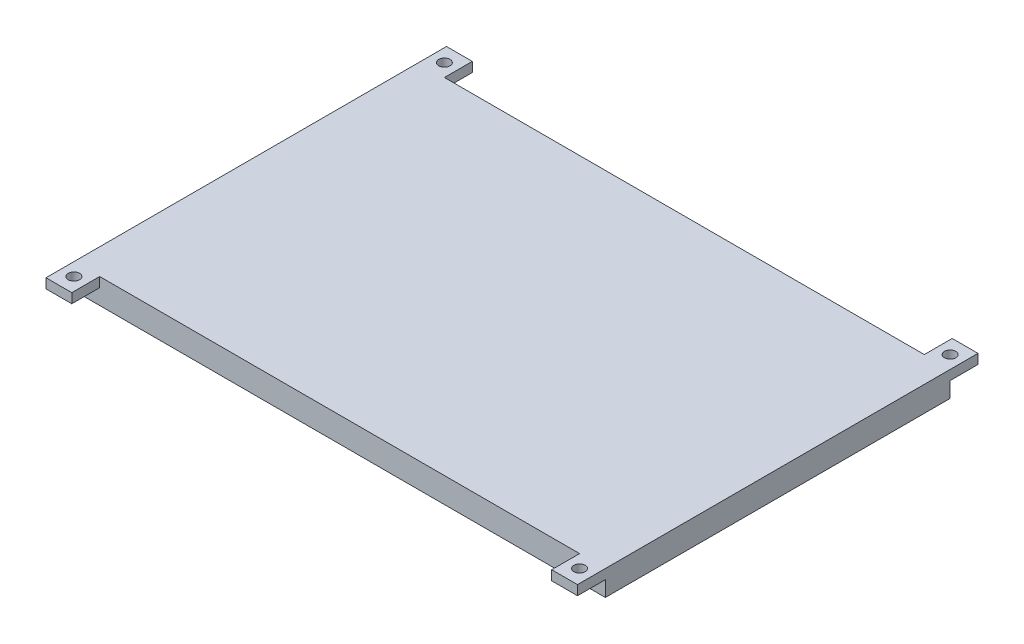
ISO-10303-21;
HEADER;
FILE_DESCRIPTION(('STEP AP214'),'2;1');
FILE_NAME('part.step','',(''),(''),'','','');
FILE_SCHEMA(('AUTOMOTIVE_DESIGN { 1 0 10303 214 1 1 1 1 }'));
ENDSEC;
DATA;
#1=APPLICATION_CONTEXT('core data for automotive mechanical design processes');
#2=APPLICATION_PROTOCOL_DEFINITION('international standard','automotive_design',2000,#1);
#3=PRODUCT_CONTEXT('',#1,'mechanical');
#4=PRODUCT('Part','Part','',(#3));
#5=PRODUCT_RELATED_PRODUCT_CATEGORY('part','',(#4));
#6=PRODUCT_DEFINITION_FORMATION('','',#4);
#7=PRODUCT_DEFINITION_CONTEXT('part definition',#1,'design');
#8=PRODUCT_DEFINITION('design','',#6,#7);
#9=PRODUCT_DEFINITION_SHAPE('','',#8);
#10=(LENGTH_UNIT() NAMED_UNIT(*) SI_UNIT(.MILLI.,.METRE.));
#11=(NAMED_UNIT(*) PLANE_ANGLE_UNIT() SI_UNIT($,.RADIAN.));
#12=(NAMED_UNIT(*) SI_UNIT($,.STERADIAN.) SOLID_ANGLE_UNIT());
#13=UNCERTAINTY_MEASURE_WITH_UNIT(LENGTH_MEASURE(1.E-05),#10,'distance_accuracy_value','');
#14=(GEOMETRIC_REPRESENTATION_CONTEXT(3) GLOBAL_UNCERTAINTY_ASSIGNED_CONTEXT((#13)) GLOBAL_UNIT_ASSIGNED_CONTEXT((#10,
#11,#12)) REPRESENTATION_CONTEXT('',''));
#15=CARTESIAN_POINT('',(0.,0.,0.));
#16=DIRECTION('',(0.,0.,1.));
#17=DIRECTION('',(1.,0.,0.));
#18=AXIS2_PLACEMENT_3D('',#15,#16,#17);
#19=CARTESIAN_POINT('',(0.,0.,0.));
#20=DIRECTION('',(0.,1.,0.));
#21=DIRECTION('',(1.,0.,0.));
#22=AXIS2_PLACEMENT_3D('',#19,#20,#21);
#23=PLANE('',#22);
#24=CARTESIAN_POINT('',(78.45,0.,57.48));
#25=DIRECTION('',(0.,-1.,0.));
#26=DIRECTION('',(1.,0.,0.));
#27=AXIS2_PLACEMENT_3D('',#24,#25,#26);
#28=CIRCLE('',#27,1.75);
#29=CARTESIAN_POINT('',(76.7,0.,57.48));
#30=VERTEX_POINT('',#29);
#31=EDGE_CURVE('E451',#30,#30,#28,.T.);
#32=ORIENTED_EDGE('',*,*,#31,.F.);
#33=EDGE_LOOP('',(#32));
#34=FACE_BOUND('',#33,.T.);
#35=DIRECTION('',(1.,0.,0.));
#36=VECTOR('',#35,1.);
#37=CARTESIAN_POINT('',(41.225,0.,53.48));
#38=LINE('',#37,#36);
#39=CARTESIAN_POINT('',(74.45,0.,53.48));
#40=VERTEX_POINT('',#39);
#41=CARTESIAN_POINT('',(82.45,0.,53.48));
#42=VERTEX_POINT('',#41);
#43=EDGE_CURVE('E229',#40,#42,#38,.T.);
#44=ORIENTED_EDGE('',*,*,#43,.T.);
#45=DIRECTION('',(0.,0.,1.));
#46=VECTOR('',#45,1.);
#47=CARTESIAN_POINT('',(82.45,0.,-62.135));
#48=LINE('',#47,#46);
#49=CARTESIAN_POINT('',(82.45,0.,62.135));
#50=VERTEX_POINT('',#49);
#51=EDGE_CURVE('E233',#42,#50,#48,.T.);
#52=ORIENTED_EDGE('',*,*,#51,.T.);
#53=DIRECTION('',(-1.,0.,0.));
#54=VECTOR('',#53,1.);
#55=CARTESIAN_POINT('',(82.45,0.,62.135));
#56=LINE('',#55,#54);
#57=CARTESIAN_POINT('',(74.45,0.,62.135));
#58=VERTEX_POINT('',#57);
#59=EDGE_CURVE('E273',#50,#58,#56,.T.);
#60=ORIENTED_EDGE('',*,*,#59,.T.);
#61=DIRECTION('',(0.,0.,1.));
#62=VECTOR('',#61,1.);
#63=CARTESIAN_POINT('',(74.45,0.,-62.135));
#64=LINE('',#63,#62);
#65=EDGE_CURVE('E235',#40,#58,#64,.T.);
#66=ORIENTED_EDGE('',*,*,#65,.F.);
#67=EDGE_LOOP('',(#44,#52,#60,#66));
#68=FACE_BOUND('',#67,.T.);
#69=ADVANCED_FACE('F17',(#34,#68),#23,.F.);
#70=CARTESIAN_POINT('',(0.,3.,0.));
#71=DIRECTION('',(0.,1.,0.));
#72=DIRECTION('',(1.,0.,0.));
#73=AXIS2_PLACEMENT_3D('',#70,#71,#72);
#74=PLANE('',#73);
#75=CARTESIAN_POINT('',(78.45,3.,-57.48));
#76=DIRECTION('',(0.,-1.,0.));
#77=DIRECTION('',(1.,0.,0.));
#78=AXIS2_PLACEMENT_3D('',#75,#76,#77);
#79=CIRCLE('',#78,1.75);
#80=CARTESIAN_POINT('',(76.7,3.,-57.48));
#81=VERTEX_POINT('',#80);
#82=EDGE_CURVE('E427',#81,#81,#79,.T.);
#83=ORIENTED_EDGE('',*,*,#82,.T.);
#84=EDGE_LOOP('',(#83));
#85=FACE_BOUND('',#84,.T.);
#86=CARTESIAN_POINT('',(-78.45,3.,-57.48));
#87=DIRECTION('',(0.,-1.,0.));
#88=DIRECTION('',(1.,0.,0.));
#89=AXIS2_PLACEMENT_3D('',#86,#87,#88);
#90=CIRCLE('',#89,1.75);
#91=CARTESIAN_POINT('',(-80.2,3.,-57.48));
#92=VERTEX_POINT('',#91);
#93=EDGE_CURVE('E436',#92,#92,#90,.T.);
#94=ORIENTED_EDGE('',*,*,#93,.T.);
#95=EDGE_LOOP('',(#94));
#96=FACE_BOUND('',#95,.T.);
#97=CARTESIAN_POINT('',(78.45,3.,57.48));
#98=DIRECTION('',(0.,-1.,0.));
#99=DIRECTION('',(1.,0.,0.));
#100=AXIS2_PLACEMENT_3D('',#97,#98,#99);
#101=CIRCLE('',#100,1.75);
#102=CARTESIAN_POINT('',(76.7,3.,57.48));
#103=VERTEX_POINT('',#102);
#104=EDGE_CURVE('E443',#103,#103,#101,.T.);
#105=ORIENTED_EDGE('',*,*,#104,.T.);
#106=EDGE_LOOP('',(#105));
#107=FACE_BOUND('',#106,.T.);
#108=CARTESIAN_POINT('',(-78.45,3.,57.48));
#109=DIRECTION('',(0.,-1.,0.));
#110=DIRECTION('',(1.,0.,0.));
#111=AXIS2_PLACEMENT_3D('',#108,#109,#110);
#112=CIRCLE('',#111,1.75);
#113=CARTESIAN_POINT('',(-80.2,3.,57.48));
#114=VERTEX_POINT('',#113);
#115=EDGE_CURVE('E453',#114,#114,#112,.T.);
#116=ORIENTED_EDGE('',*,*,#115,.T.);
#117=EDGE_LOOP('',(#116));
#118=FACE_BOUND('',#117,.T.);
#119=DIRECTION('',(-1.,0.,0.));
#120=VECTOR('',#119,1.);
#121=CARTESIAN_POINT('',(-82.45,3.,-62.135));
#122=LINE('',#121,#120);
#123=CARTESIAN_POINT('',(82.45,3.,-62.135));
#124=VERTEX_POINT('',#123);
#125=CARTESIAN_POINT('',(74.45,3.,-62.135));
#126=VERTEX_POINT('',#125);
#127=EDGE_CURVE('E11',#124,#126,#122,.T.);
#128=ORIENTED_EDGE('',*,*,#127,.T.);
#129=DIRECTION('',(0.,0.,1.));
#130=VECTOR('',#129,1.);
#131=CARTESIAN_POINT('',(74.45,3.,-62.135));
#132=LINE('',#131,#130);
#133=CARTESIAN_POINT('',(74.45,3.,-53.48));
#134=VERTEX_POINT('',#133);
#135=EDGE_CURVE('E42',#126,#134,#132,.T.);
#136=ORIENTED_EDGE('',*,*,#135,.T.);
#137=DIRECTION('',(-1.,0.,0.));
#138=VECTOR('',#137,1.);
#139=CARTESIAN_POINT('',(74.45,3.,-53.48));
#140=LINE('',#139,#138);
#141=CARTESIAN_POINT('',(-74.45,3.,-53.48));
#142=VERTEX_POINT('',#141);
#143=EDGE_CURVE('E316',#134,#142,#140,.T.);
#144=ORIENTED_EDGE('',*,*,#143,.T.);
#145=DIRECTION('',(0.,0.,-1.));
#146=VECTOR('',#145,1.);
#147=CARTESIAN_POINT('',(-74.45,3.,62.135));
#148=LINE('',#147,#146);
#149=CARTESIAN_POINT('',(-74.45,3.,-62.135));
#150=VERTEX_POINT('',#149);
#151=EDGE_CURVE('E308',#142,#150,#148,.T.);
#152=ORIENTED_EDGE('',*,*,#151,.T.);
#153=DIRECTION('',(-1.,0.,0.));
#154=VECTOR('',#153,1.);
#155=CARTESIAN_POINT('',(-82.45,3.,-62.135));
#156=LINE('',#155,#154);
#157=CARTESIAN_POINT('',(-82.45,3.,-62.135));
#158=VERTEX_POINT('',#157);
#159=EDGE_CURVE('E307',#150,#158,#156,.T.);
#160=ORIENTED_EDGE('',*,*,#159,.T.);
#161=DIRECTION('',(0.,0.,1.));
#162=VECTOR('',#161,1.);
#163=CARTESIAN_POINT('',(-82.45,3.,62.135));
#164=LINE('',#163,#162);
#165=CARTESIAN_POINT('',(-82.45,3.,62.135));
#166=VERTEX_POINT('',#165);
#167=EDGE_CURVE('E291',#158,#166,#164,.T.);
#168=ORIENTED_EDGE('',*,*,#167,.T.);
#169=DIRECTION('',(1.,0.,0.));
#170=VECTOR('',#169,1.);
#171=CARTESIAN_POINT('',(82.45,3.,62.135));
#172=LINE('',#171,#170);
#173=CARTESIAN_POINT('',(-74.45,3.,62.135));
#174=VERTEX_POINT('',#173);
#175=EDGE_CURVE('E292',#166,#174,#172,.T.);
#176=ORIENTED_EDGE('',*,*,#175,.T.);
#177=DIRECTION('',(0.,0.,-1.));
#178=VECTOR('',#177,1.);
#179=CARTESIAN_POINT('',(-74.45,3.,62.135));
#180=LINE('',#179,#178);
#181=CARTESIAN_POINT('',(-74.45,3.,53.48));
#182=VERTEX_POINT('',#181);
#183=EDGE_CURVE('E240',#174,#182,#180,.T.);
#184=ORIENTED_EDGE('',*,*,#183,.T.);
#185=DIRECTION('',(1.,0.,0.));
#186=VECTOR('',#185,1.);
#187=CARTESIAN_POINT('',(-74.45,3.,53.48));
#188=LINE('',#187,#186);
#189=CARTESIAN_POINT('',(74.45,3.,53.48));
#190=VERTEX_POINT('',#189);
#191=EDGE_CURVE('E281',#182,#190,#188,.T.);
#192=ORIENTED_EDGE('',*,*,#191,.T.);
#193=DIRECTION('',(0.,0.,1.));
#194=VECTOR('',#193,1.);
#195=CARTESIAN_POINT('',(74.45,3.,-62.135));
#196=LINE('',#195,#194);
#197=CARTESIAN_POINT('',(74.45,3.,62.135));
#198=VERTEX_POINT('',#197);
#199=EDGE_CURVE('E276',#190,#198,#196,.T.);
#200=ORIENTED_EDGE('',*,*,#199,.T.);
#201=DIRECTION('',(1.,0.,0.));
#202=VECTOR('',#201,1.);
#203=CARTESIAN_POINT('',(82.45,3.,62.135));
#204=LINE('',#203,#202);
#205=CARTESIAN_POINT('',(82.45,3.,62.135));
#206=VERTEX_POINT('',#205);
#207=EDGE_CURVE('E485',#198,#206,#204,.T.);
#208=ORIENTED_EDGE('',*,*,#207,.T.);
#209=DIRECTION('',(0.,0.,-1.));
#210=VECTOR('',#209,1.);
#211=CARTESIAN_POINT('',(82.45,3.,-62.135));
#212=LINE('',#211,#210);
#213=EDGE_CURVE('E265',#206,#124,#212,.T.);
#214=ORIENTED_EDGE('',*,*,#213,.T.);
#215=EDGE_LOOP('',(#128,#136,#144,#152,#160,#168,#176,#184,#192,#200,#208,#214));
#216=FACE_BOUND('',#215,.T.);
#217=ADVANCED_FACE('F336',(#85,#96,#107,#118,#216),#74,.T.);
#218=CARTESIAN_POINT('',(82.45,0.,-62.135));
#219=DIRECTION('',(0.,0.,-1.));
#220=DIRECTION('',(-1.,0.,0.));
#221=AXIS2_PLACEMENT_3D('',#218,#219,#220);
#222=PLANE('',#221);
#223=DIRECTION('',(1.,0.,0.));
#224=VECTOR('',#223,1.);
#225=CARTESIAN_POINT('',(-82.45,0.,-62.135));
#226=LINE('',#225,#224);
#227=CARTESIAN_POINT('',(74.45,0.,-62.135));
#228=VERTEX_POINT('',#227);
#229=CARTESIAN_POINT('',(82.45,0.,-62.135));
#230=VERTEX_POINT('',#229);
#231=EDGE_CURVE('E379',#228,#230,#226,.T.);
#232=ORIENTED_EDGE('',*,*,#231,.F.);
#233=DIRECTION('',(0.,1.,0.));
#234=VECTOR('',#233,1.);
#235=CARTESIAN_POINT('',(74.45,0.,-62.135));
#236=LINE('',#235,#234);
#237=EDGE_CURVE('E25',#228,#126,#236,.T.);
#238=ORIENTED_EDGE('',*,*,#237,.T.);
#239=ORIENTED_EDGE('',*,*,#127,.F.);
#240=DIRECTION('',(0.,1.,0.));
#241=VECTOR('',#240,1.);
#242=CARTESIAN_POINT('',(82.45,0.,-62.135));
#243=LINE('',#242,#241);
#244=EDGE_CURVE('E268',#230,#124,#243,.T.);
#245=ORIENTED_EDGE('',*,*,#244,.F.);
#246=EDGE_LOOP('',(#232,#238,#239,#245));
#247=FACE_BOUND('',#246,.T.);
#248=ADVANCED_FACE('F555',(#247),#222,.T.);
#249=CARTESIAN_POINT('',(74.45,0.,-62.135));
#250=DIRECTION('',(-1.,0.,0.));
#251=DIRECTION('',(0.,0.,1.));
#252=AXIS2_PLACEMENT_3D('',#249,#250,#251);
#253=PLANE('',#252);
#254=DIRECTION('',(0.,0.,1.));
#255=VECTOR('',#254,1.);
#256=CARTESIAN_POINT('',(74.45,0.,-62.135));
#257=LINE('',#256,#255);
#258=CARTESIAN_POINT('',(74.45,0.,-53.48));
#259=VERTEX_POINT('',#258);
#260=EDGE_CURVE('E329',#228,#259,#257,.T.);
#261=ORIENTED_EDGE('',*,*,#260,.T.);
#262=DIRECTION('',(0.,1.,0.));
#263=VECTOR('',#262,1.);
#264=CARTESIAN_POINT('',(74.45,0.,-53.48));
#265=LINE('',#264,#263);
#266=EDGE_CURVE('E319',#259,#134,#265,.T.);
#267=ORIENTED_EDGE('',*,*,#266,.T.);
#268=ORIENTED_EDGE('',*,*,#135,.F.);
#269=ORIENTED_EDGE('',*,*,#237,.F.);
#270=EDGE_LOOP('',(#261,#267,#268,#269));
#271=FACE_BOUND('',#270,.T.);
#272=ADVANCED_FACE('F327',(#271),#253,.T.);
#273=CARTESIAN_POINT('',(74.45,0.,-53.48));
#274=DIRECTION('',(0.,0.,-1.));
#275=DIRECTION('',(0.,-1.,0.));
#276=AXIS2_PLACEMENT_3D('',#273,#274,#275);
#277=PLANE('',#276);
#278=DIRECTION('',(0.,1.,0.));
#279=VECTOR('',#278,1.);
#280=CARTESIAN_POINT('',(-74.45,0.,-53.48));
#281=LINE('',#280,#279);
#282=CARTESIAN_POINT('',(-74.45,0.,-53.48));
#283=VERTEX_POINT('',#282);
#284=EDGE_CURVE('E311',#283,#142,#281,.T.);
#285=ORIENTED_EDGE('',*,*,#284,.T.);
#286=ORIENTED_EDGE('',*,*,#143,.F.);
#287=ORIENTED_EDGE('',*,*,#266,.F.);
#288=DIRECTION('',(-1.,0.,0.));
#289=VECTOR('',#288,1.);
#290=CARTESIAN_POINT('',(-41.225,0.,-53.48));
#291=LINE('',#290,#289);
#292=CARTESIAN_POINT('',(82.45,0.,-53.48));
#293=VERTEX_POINT('',#292);
#294=EDGE_CURVE('E377',#293,#259,#291,.T.);
#295=ORIENTED_EDGE('',*,*,#294,.F.);
#296=DIRECTION('',(0.,-1.,0.));
#297=VECTOR('',#296,1.);
#298=CARTESIAN_POINT('',(82.45,0.,-53.48));
#299=LINE('',#298,#297);
#300=CARTESIAN_POINT('',(82.45,-4.8,-53.48));
#301=VERTEX_POINT('',#300);
#302=EDGE_CURVE('E252',#293,#301,#299,.T.);
#303=ORIENTED_EDGE('',*,*,#302,.T.);
#304=DIRECTION('',(1.,0.,0.));
#305=VECTOR('',#304,1.);
#306=CARTESIAN_POINT('',(82.45,-4.8,-53.48));
#307=LINE('',#306,#305);
#308=CARTESIAN_POINT('',(-82.45,-4.8,-53.48));
#309=VERTEX_POINT('',#308);
#310=EDGE_CURVE('E474',#309,#301,#307,.T.);
#311=ORIENTED_EDGE('',*,*,#310,.F.);
#312=DIRECTION('',(0.,-1.,0.));
#313=VECTOR('',#312,1.);
#314=CARTESIAN_POINT('',(-82.45,0.,-53.48));
#315=LINE('',#314,#313);
#316=CARTESIAN_POINT('',(-82.45,0.,-53.48));
#317=VERTEX_POINT('',#316);
#318=EDGE_CURVE('E304',#317,#309,#315,.T.);
#319=ORIENTED_EDGE('',*,*,#318,.F.);
#320=DIRECTION('',(-1.,0.,0.));
#321=VECTOR('',#320,1.);
#322=CARTESIAN_POINT('',(-41.225,0.,-53.48));
#323=LINE('',#322,#321);
#324=EDGE_CURVE('E359',#283,#317,#323,.T.);
#325=ORIENTED_EDGE('',*,*,#324,.F.);
#326=EDGE_LOOP('',(#285,#286,#287,#295,#303,#311,#319,#325));
#327=FACE_BOUND('',#326,.T.);
#328=ADVANCED_FACE('F333',(#327),#277,.T.);
#329=CARTESIAN_POINT('',(-74.45,0.,-53.48));
#330=DIRECTION('',(1.,0.,0.));
#331=DIRECTION('',(0.,1.,0.));
#332=AXIS2_PLACEMENT_3D('',#329,#330,#331);
#333=PLANE('',#332);
#334=DIRECTION('',(0.,0.,-1.));
#335=VECTOR('',#334,1.);
#336=CARTESIAN_POINT('',(-74.45,0.,62.135));
#337=LINE('',#336,#335);
#338=CARTESIAN_POINT('',(-74.45,0.,-62.135));
#339=VERTEX_POINT('',#338);
#340=EDGE_CURVE('E343',#283,#339,#337,.T.);
#341=ORIENTED_EDGE('',*,*,#340,.T.);
#342=DIRECTION('',(0.,1.,0.));
#343=VECTOR('',#342,1.);
#344=CARTESIAN_POINT('',(-74.45,0.,-62.135));
#345=LINE('',#344,#343);
#346=EDGE_CURVE('E312',#339,#150,#345,.T.);
#347=ORIENTED_EDGE('',*,*,#346,.T.);
#348=ORIENTED_EDGE('',*,*,#151,.F.);
#349=ORIENTED_EDGE('',*,*,#284,.F.);
#350=EDGE_LOOP('',(#341,#347,#348,#349));
#351=FACE_BOUND('',#350,.T.);
#352=ADVANCED_FACE('F341',(#351),#333,.T.);
#353=CARTESIAN_POINT('',(-74.45,0.,-62.135));
#354=DIRECTION('',(0.,0.,-1.));
#355=DIRECTION('',(-1.,0.,0.));
#356=AXIS2_PLACEMENT_3D('',#353,#354,#355);
#357=PLANE('',#356);
#358=DIRECTION('',(1.,0.,0.));
#359=VECTOR('',#358,1.);
#360=CARTESIAN_POINT('',(-82.45,0.,-62.135));
#361=LINE('',#360,#359);
#362=CARTESIAN_POINT('',(-82.45,0.,-62.135));
#363=VERTEX_POINT('',#362);
#364=EDGE_CURVE('E367',#363,#339,#361,.T.);
#365=ORIENTED_EDGE('',*,*,#364,.F.);
#366=DIRECTION('',(0.,1.,0.));
#367=VECTOR('',#366,1.);
#368=CARTESIAN_POINT('',(-82.45,0.,-62.135));
#369=LINE('',#368,#367);
#370=EDGE_CURVE('E300',#363,#158,#369,.T.);
#371=ORIENTED_EDGE('',*,*,#370,.T.);
#372=ORIENTED_EDGE('',*,*,#159,.F.);
#373=ORIENTED_EDGE('',*,*,#346,.F.);
#374=EDGE_LOOP('',(#365,#371,#372,#373));
#375=FACE_BOUND('',#374,.T.);
#376=ADVANCED_FACE('F349',(#375),#357,.T.);
#377=CARTESIAN_POINT('',(-82.45,0.,-62.135));
#378=DIRECTION('',(-1.,0.,0.));
#379=DIRECTION('',(0.,1.,0.));
#380=AXIS2_PLACEMENT_3D('',#377,#378,#379);
#381=PLANE('',#380);
#382=DIRECTION('',(0.,0.,-1.));
#383=VECTOR('',#382,1.);
#384=CARTESIAN_POINT('',(-82.45,0.,62.135));
#385=LINE('',#384,#383);
#386=CARTESIAN_POINT('',(-82.45,0.,62.135));
#387=VERTEX_POINT('',#386);
#388=CARTESIAN_POINT('',(-82.45,0.,53.48));
#389=VERTEX_POINT('',#388);
#390=EDGE_CURVE('E407',#387,#389,#385,.T.);
#391=ORIENTED_EDGE('',*,*,#390,.F.);
#392=DIRECTION('',(0.,1.,0.));
#393=VECTOR('',#392,1.);
#394=CARTESIAN_POINT('',(-82.45,0.,62.135));
#395=LINE('',#394,#393);
#396=EDGE_CURVE('E287',#387,#166,#395,.T.);
#397=ORIENTED_EDGE('',*,*,#396,.T.);
#398=ORIENTED_EDGE('',*,*,#167,.F.);
#399=ORIENTED_EDGE('',*,*,#370,.F.);
#400=DIRECTION('',(0.,0.,-1.));
#401=VECTOR('',#400,1.);
#402=CARTESIAN_POINT('',(-82.45,0.,62.135));
#403=LINE('',#402,#401);
#404=EDGE_CURVE('E363',#317,#363,#403,.T.);
#405=ORIENTED_EDGE('',*,*,#404,.F.);
#406=ORIENTED_EDGE('',*,*,#318,.T.);
#407=DIRECTION('',(0.,0.,-1.));
#408=VECTOR('',#407,1.);
#409=CARTESIAN_POINT('',(-82.45,-4.8,-53.48));
#410=LINE('',#409,#408);
#411=CARTESIAN_POINT('',(-82.45,-4.8,53.48));
#412=VERTEX_POINT('',#411);
#413=EDGE_CURVE('E477',#412,#309,#410,.T.);
#414=ORIENTED_EDGE('',*,*,#413,.F.);
#415=DIRECTION('',(0.,-1.,0.));
#416=VECTOR('',#415,1.);
#417=CARTESIAN_POINT('',(-82.45,0.,53.48));
#418=LINE('',#417,#416);
#419=EDGE_CURVE('E241',#389,#412,#418,.T.);
#420=ORIENTED_EDGE('',*,*,#419,.F.);
#421=EDGE_LOOP('',(#391,#397,#398,#399,#405,#406,#414,#420));
#422=FACE_BOUND('',#421,.T.);
#423=ADVANCED_FACE('F543',(#422),#381,.T.);
#424=CARTESIAN_POINT('',(-82.45,0.,62.135));
#425=DIRECTION('',(0.,0.,1.));
#426=DIRECTION('',(1.,0.,0.));
#427=AXIS2_PLACEMENT_3D('',#424,#425,#426);
#428=PLANE('',#427);
#429=DIRECTION('',(-1.,0.,0.));
#430=VECTOR('',#429,1.);
#431=CARTESIAN_POINT('',(82.45,0.,62.135));
#432=LINE('',#431,#430);
#433=CARTESIAN_POINT('',(-74.45,0.,62.135));
#434=VERTEX_POINT('',#433);
#435=EDGE_CURVE('E403',#434,#387,#432,.T.);
#436=ORIENTED_EDGE('',*,*,#435,.F.);
#437=DIRECTION('',(0.,1.,0.));
#438=VECTOR('',#437,1.);
#439=CARTESIAN_POINT('',(-74.45,0.,62.135));
#440=LINE('',#439,#438);
#441=EDGE_CURVE('E295',#434,#174,#440,.T.);
#442=ORIENTED_EDGE('',*,*,#441,.T.);
#443=ORIENTED_EDGE('',*,*,#175,.F.);
#444=ORIENTED_EDGE('',*,*,#396,.F.);
#445=EDGE_LOOP('',(#436,#442,#443,#444));
#446=FACE_BOUND('',#445,.T.);
#447=ADVANCED_FACE('F821',(#446),#428,.T.);
#448=CARTESIAN_POINT('',(-74.45,0.,62.135));
#449=DIRECTION('',(1.,0.,0.));
#450=DIRECTION('',(0.,1.,0.));
#451=AXIS2_PLACEMENT_3D('',#448,#449,#450);
#452=PLANE('',#451);
#453=DIRECTION('',(0.,0.,-1.));
#454=VECTOR('',#453,1.);
#455=CARTESIAN_POINT('',(-74.45,0.,62.135));
#456=LINE('',#455,#454);
#457=CARTESIAN_POINT('',(-74.45,0.,53.48));
#458=VERTEX_POINT('',#457);
#459=EDGE_CURVE('E399',#434,#458,#456,.T.);
#460=ORIENTED_EDGE('',*,*,#459,.T.);
#461=DIRECTION('',(0.,1.,0.));
#462=VECTOR('',#461,1.);
#463=CARTESIAN_POINT('',(-74.45,0.,53.48));
#464=LINE('',#463,#462);
#465=EDGE_CURVE('E284',#458,#182,#464,.T.);
#466=ORIENTED_EDGE('',*,*,#465,.T.);
#467=ORIENTED_EDGE('',*,*,#183,.F.);
#468=ORIENTED_EDGE('',*,*,#441,.F.);
#469=EDGE_LOOP('',(#460,#466,#467,#468));
#470=FACE_BOUND('',#469,.T.);
#471=ADVANCED_FACE('F534',(#470),#452,.T.);
#472=CARTESIAN_POINT('',(-74.45,0.,53.48));
#473=DIRECTION('',(0.,0.,1.));
#474=DIRECTION('',(1.,0.,0.));
#475=AXIS2_PLACEMENT_3D('',#472,#473,#474);
#476=PLANE('',#475);
#477=DIRECTION('',(0.,1.,0.));
#478=VECTOR('',#477,1.);
#479=CARTESIAN_POINT('',(74.45,0.,53.48));
#480=LINE('',#479,#478);
#481=EDGE_CURVE('E278',#40,#190,#480,.T.);
#482=ORIENTED_EDGE('',*,*,#481,.T.);
#483=ORIENTED_EDGE('',*,*,#191,.F.);
#484=ORIENTED_EDGE('',*,*,#465,.F.);
#485=DIRECTION('',(1.,0.,0.));
#486=VECTOR('',#485,1.);
#487=CARTESIAN_POINT('',(41.225,0.,53.48));
#488=LINE('',#487,#486);
#489=EDGE_CURVE('E395',#389,#458,#488,.T.);
#490=ORIENTED_EDGE('',*,*,#489,.F.);
#491=ORIENTED_EDGE('',*,*,#419,.T.);
#492=DIRECTION('',(-1.,0.,0.));
#493=VECTOR('',#492,1.);
#494=CARTESIAN_POINT('',(-82.45,-4.8,53.48));
#495=LINE('',#494,#493);
#496=CARTESIAN_POINT('',(82.45,-4.8,53.48));
#497=VERTEX_POINT('',#496);
#498=EDGE_CURVE('E247',#497,#412,#495,.T.);
#499=ORIENTED_EDGE('',*,*,#498,.F.);
#500=DIRECTION('',(0.,-1.,0.));
#501=VECTOR('',#500,1.);
#502=CARTESIAN_POINT('',(82.45,0.,53.48));
#503=LINE('',#502,#501);
#504=EDGE_CURVE('E244',#42,#497,#503,.T.);
#505=ORIENTED_EDGE('',*,*,#504,.F.);
#506=ORIENTED_EDGE('',*,*,#43,.F.);
#507=EDGE_LOOP('',(#482,#483,#484,#490,#491,#499,#505,#506));
#508=FACE_BOUND('',#507,.T.);
#509=ADVANCED_FACE('F245',(#508),#476,.T.);
#510=CARTESIAN_POINT('',(74.45,0.,53.48));
#511=DIRECTION('',(-1.,0.,0.));
#512=DIRECTION('',(0.,0.,1.));
#513=AXIS2_PLACEMENT_3D('',#510,#511,#512);
#514=PLANE('',#513);
#515=ORIENTED_EDGE('',*,*,#65,.T.);
#516=DIRECTION('',(0.,1.,0.));
#517=VECTOR('',#516,1.);
#518=CARTESIAN_POINT('',(74.45,0.,62.135));
#519=LINE('',#518,#517);
#520=EDGE_CURVE('E277',#58,#198,#519,.T.);
#521=ORIENTED_EDGE('',*,*,#520,.T.);
#522=ORIENTED_EDGE('',*,*,#199,.F.);
#523=ORIENTED_EDGE('',*,*,#481,.F.);
#524=EDGE_LOOP('',(#515,#521,#522,#523));
#525=FACE_BOUND('',#524,.T.);
#526=ADVANCED_FACE('F528',(#525),#514,.T.);
#527=CARTESIAN_POINT('',(74.45,0.,62.135));
#528=DIRECTION('',(0.,0.,1.));
#529=DIRECTION('',(1.,0.,0.));
#530=AXIS2_PLACEMENT_3D('',#527,#528,#529);
#531=PLANE('',#530);
#532=ORIENTED_EDGE('',*,*,#59,.F.);
#533=DIRECTION('',(0.,1.,0.));
#534=VECTOR('',#533,1.);
#535=CARTESIAN_POINT('',(82.45,0.,62.135));
#536=LINE('',#535,#534);
#537=EDGE_CURVE('E258',#50,#206,#536,.T.);
#538=ORIENTED_EDGE('',*,*,#537,.T.);
#539=ORIENTED_EDGE('',*,*,#207,.F.);
#540=ORIENTED_EDGE('',*,*,#520,.F.);
#541=EDGE_LOOP('',(#532,#538,#539,#540));
#542=FACE_BOUND('',#541,.T.);
#543=ADVANCED_FACE('F524',(#542),#531,.T.);
#544=CARTESIAN_POINT('',(82.45,0.,62.135));
#545=DIRECTION('',(1.,0.,0.));
#546=DIRECTION('',(0.,1.,0.));
#547=AXIS2_PLACEMENT_3D('',#544,#545,#546);
#548=PLANE('',#547);
#549=DIRECTION('',(0.,0.,1.));
#550=VECTOR('',#549,1.);
#551=CARTESIAN_POINT('',(82.45,0.,-62.135));
#552=LINE('',#551,#550);
#553=EDGE_CURVE('E384',#230,#293,#552,.T.);
#554=ORIENTED_EDGE('',*,*,#553,.F.);
#555=ORIENTED_EDGE('',*,*,#244,.T.);
#556=ORIENTED_EDGE('',*,*,#213,.F.);
#557=ORIENTED_EDGE('',*,*,#537,.F.);
#558=ORIENTED_EDGE('',*,*,#51,.F.);
#559=ORIENTED_EDGE('',*,*,#504,.T.);
#560=DIRECTION('',(0.,0.,1.));
#561=VECTOR('',#560,1.);
#562=CARTESIAN_POINT('',(82.45,-4.8,53.48));
#563=LINE('',#562,#561);
#564=EDGE_CURVE('E471',#301,#497,#563,.T.);
#565=ORIENTED_EDGE('',*,*,#564,.F.);
#566=ORIENTED_EDGE('',*,*,#302,.F.);
#567=EDGE_LOOP('',(#554,#555,#556,#557,#558,#559,#565,#566));
#568=FACE_BOUND('',#567,.T.);
#569=ADVANCED_FACE('F255',(#568),#548,.T.);
#570=CARTESIAN_POINT('',(-78.45,0.,57.48));
#571=DIRECTION('',(0.,1.,0.));
#572=DIRECTION('',(1.,0.,0.));
#573=AXIS2_PLACEMENT_3D('',#570,#571,#572);
#574=CYLINDRICAL_SURFACE('',#573,1.75);
#575=ORIENTED_EDGE('',*,*,#115,.F.);
#576=DIRECTION('',(0.,-1.,0.));
#577=VECTOR('',#576,1.);
#578=CARTESIAN_POINT('',(-80.2,0.,57.48));
#579=LINE('',#578,#577);
#580=CARTESIAN_POINT('',(-80.2,0.,57.48));
#581=VERTEX_POINT('',#580);
#582=EDGE_CURVE('E456',#114,#581,#579,.T.);
#583=ORIENTED_EDGE('',*,*,#582,.T.);
#584=CARTESIAN_POINT('',(-78.45,0.,57.48));
#585=DIRECTION('',(0.,-1.,0.));
#586=DIRECTION('',(1.,0.,0.));
#587=AXIS2_PLACEMENT_3D('',#584,#585,#586);
#588=CIRCLE('',#587,1.75);
#589=EDGE_CURVE('E413',#581,#581,#588,.T.);
#590=ORIENTED_EDGE('',*,*,#589,.T.);
#591=ORIENTED_EDGE('',*,*,#582,.F.);
#592=EDGE_LOOP('',(#575,#583,#590,#591));
#593=FACE_BOUND('',#592,.T.);
#594=ADVANCED_FACE('F764',(#593),#574,.F.);
#595=CARTESIAN_POINT('',(78.45,0.,57.48));
#596=DIRECTION('',(0.,1.,0.));
#597=DIRECTION('',(1.,0.,0.));
#598=AXIS2_PLACEMENT_3D('',#595,#596,#597);
#599=CYLINDRICAL_SURFACE('',#598,1.75);
#600=ORIENTED_EDGE('',*,*,#104,.F.);
#601=DIRECTION('',(0.,-1.,0.));
#602=VECTOR('',#601,1.);
#603=CARTESIAN_POINT('',(76.7,0.,57.48));
#604=LINE('',#603,#602);
#605=EDGE_CURVE('E447',#103,#30,#604,.T.);
#606=ORIENTED_EDGE('',*,*,#605,.T.);
#607=ORIENTED_EDGE('',*,*,#31,.T.);
#608=ORIENTED_EDGE('',*,*,#605,.F.);
#609=EDGE_LOOP('',(#600,#606,#607,#608));
#610=FACE_BOUND('',#609,.T.);
#611=ADVANCED_FACE('F684',(#610),#599,.F.);
#612=CARTESIAN_POINT('',(-78.45,0.,-57.48));
#613=DIRECTION('',(0.,1.,0.));
#614=DIRECTION('',(1.,0.,0.));
#615=AXIS2_PLACEMENT_3D('',#612,#613,#614);
#616=CYLINDRICAL_SURFACE('',#615,1.75);
#617=ORIENTED_EDGE('',*,*,#93,.F.);
#618=DIRECTION('',(0.,-1.,0.));
#619=VECTOR('',#618,1.);
#620=CARTESIAN_POINT('',(-80.2,0.,-57.48));
#621=LINE('',#620,#619);
#622=CARTESIAN_POINT('',(-80.2,0.,-57.48));
#623=VERTEX_POINT('',#622);
#624=EDGE_CURVE('E440',#92,#623,#621,.T.);
#625=ORIENTED_EDGE('',*,*,#624,.T.);
#626=CARTESIAN_POINT('',(-78.45,0.,-57.48));
#627=DIRECTION('',(0.,-1.,0.));
#628=DIRECTION('',(1.,0.,0.));
#629=AXIS2_PLACEMENT_3D('',#626,#627,#628);
#630=CIRCLE('',#629,1.75);
#631=EDGE_CURVE('E370',#623,#623,#630,.T.);
#632=ORIENTED_EDGE('',*,*,#631,.T.);
#633=ORIENTED_EDGE('',*,*,#624,.F.);
#634=EDGE_LOOP('',(#617,#625,#632,#633));
#635=FACE_BOUND('',#634,.T.);
#636=ADVANCED_FACE('F678',(#635),#616,.F.);
#637=CARTESIAN_POINT('',(78.45,0.,-57.48));
#638=DIRECTION('',(0.,1.,0.));
#639=DIRECTION('',(1.,0.,0.));
#640=AXIS2_PLACEMENT_3D('',#637,#638,#639);
#641=CYLINDRICAL_SURFACE('',#640,1.75);
#642=ORIENTED_EDGE('',*,*,#82,.F.);
#643=DIRECTION('',(0.,-1.,0.));
#644=VECTOR('',#643,1.);
#645=CARTESIAN_POINT('',(76.7,0.,-57.48));
#646=LINE('',#645,#644);
#647=CARTESIAN_POINT('',(76.7,0.,-57.48));
#648=VERTEX_POINT('',#647);
#649=EDGE_CURVE('E431',#81,#648,#646,.T.);
#650=ORIENTED_EDGE('',*,*,#649,.T.);
#651=CARTESIAN_POINT('',(78.45,0.,-57.48));
#652=DIRECTION('',(0.,-1.,0.));
#653=DIRECTION('',(1.,0.,0.));
#654=AXIS2_PLACEMENT_3D('',#651,#652,#653);
#655=CIRCLE('',#654,1.75);
#656=EDGE_CURVE('E391',#648,#648,#655,.T.);
#657=ORIENTED_EDGE('',*,*,#656,.T.);
#658=ORIENTED_EDGE('',*,*,#649,.F.);
#659=EDGE_LOOP('',(#642,#650,#657,#658));
#660=FACE_BOUND('',#659,.T.);
#661=ADVANCED_FACE('F683',(#660),#641,.F.);
#662=CARTESIAN_POINT('',(0.,-5.,0.));
#663=DIRECTION('',(0.,-1.,0.));
#664=DIRECTION('',(0.,0.,-1.));
#665=AXIS2_PLACEMENT_3D('',#662,#663,#664);
#666=PLANE('',#665);
#667=DIRECTION('',(1.,0.,0.));
#668=VECTOR('',#667,1.);
#669=CARTESIAN_POINT('',(77.45,-5.,-48.48));
#670=LINE('',#669,#668);
#671=CARTESIAN_POINT('',(-77.45,-5.,-48.48));
#672=VERTEX_POINT('',#671);
#673=CARTESIAN_POINT('',(77.45,-5.,-48.48));
#674=VERTEX_POINT('',#673);
#675=EDGE_CURVE('E357',#672,#674,#670,.T.);
#676=ORIENTED_EDGE('',*,*,#675,.T.);
#677=DIRECTION('',(0.,0.,1.));
#678=VECTOR('',#677,1.);
#679=CARTESIAN_POINT('',(77.45,-5.,48.48));
#680=LINE('',#679,#678);
#681=CARTESIAN_POINT('',(77.45,-5.,48.48));
#682=VERTEX_POINT('',#681);
#683=EDGE_CURVE('E424',#674,#682,#680,.T.);
#684=ORIENTED_EDGE('',*,*,#683,.T.);
#685=DIRECTION('',(-1.,0.,0.));
#686=VECTOR('',#685,1.);
#687=CARTESIAN_POINT('',(-77.45,-5.,48.48));
#688=LINE('',#687,#686);
#689=CARTESIAN_POINT('',(-77.45,-5.,48.48));
#690=VERTEX_POINT('',#689);
#691=EDGE_CURVE('E417',#682,#690,#688,.T.);
#692=ORIENTED_EDGE('',*,*,#691,.T.);
#693=DIRECTION('',(0.,0.,-1.));
#694=VECTOR('',#693,1.);
#695=CARTESIAN_POINT('',(-77.45,-5.,-48.48));
#696=LINE('',#695,#694);
#697=EDGE_CURVE('E498',#690,#672,#696,.T.);
#698=ORIENTED_EDGE('',*,*,#697,.T.);
#699=EDGE_LOOP('',(#676,#684,#692,#698));
#700=FACE_BOUND('',#699,.T.);
#701=ADVANCED_FACE('F693',(#700),#666,.T.);
#702=CARTESIAN_POINT('',(77.45,0.,-48.48));
#703=DIRECTION('',(1.,0.,0.));
#704=DIRECTION('',(0.,1.,0.));
#705=AXIS2_PLACEMENT_3D('',#702,#703,#704);
#706=PLANE('',#705);
#707=DIRECTION('',(0.,0.,1.));
#708=VECTOR('',#707,1.);
#709=CARTESIAN_POINT('',(77.45,-4.8,-24.24));
#710=LINE('',#709,#708);
#711=CARTESIAN_POINT('',(77.45,-4.8,-48.48));
#712=VERTEX_POINT('',#711);
#713=CARTESIAN_POINT('',(77.45,-4.8,48.48));
#714=VERTEX_POINT('',#713);
#715=EDGE_CURVE('E480',#712,#714,#710,.T.);
#716=ORIENTED_EDGE('',*,*,#715,.T.);
#717=DIRECTION('',(0.,-1.,0.));
#718=VECTOR('',#717,1.);
#719=CARTESIAN_POINT('',(77.45,0.,48.48));
#720=LINE('',#719,#718);
#721=EDGE_CURVE('E420',#714,#682,#720,.T.);
#722=ORIENTED_EDGE('',*,*,#721,.T.);
#723=ORIENTED_EDGE('',*,*,#683,.F.);
#724=DIRECTION('',(0.,-1.,0.));
#725=VECTOR('',#724,1.);
#726=CARTESIAN_POINT('',(77.45,0.,-48.48));
#727=LINE('',#726,#725);
#728=EDGE_CURVE('E513',#712,#674,#727,.T.);
#729=ORIENTED_EDGE('',*,*,#728,.F.);
#730=EDGE_LOOP('',(#716,#722,#723,#729));
#731=FACE_BOUND('',#730,.T.);
#732=ADVANCED_FACE('F698',(#731),#706,.T.);
#733=CARTESIAN_POINT('',(77.45,0.,48.48));
#734=DIRECTION('',(0.,0.,1.));
#735=DIRECTION('',(1.,0.,0.));
#736=AXIS2_PLACEMENT_3D('',#733,#734,#735);
#737=PLANE('',#736);
#738=DIRECTION('',(-1.,0.,0.));
#739=VECTOR('',#738,1.);
#740=CARTESIAN_POINT('',(38.725,-4.8,48.48));
#741=LINE('',#740,#739);
#742=CARTESIAN_POINT('',(-77.45,-4.8,48.48));
#743=VERTEX_POINT('',#742);
#744=EDGE_CURVE('E499',#714,#743,#741,.T.);
#745=ORIENTED_EDGE('',*,*,#744,.T.);
#746=DIRECTION('',(0.,-1.,0.));
#747=VECTOR('',#746,1.);
#748=CARTESIAN_POINT('',(-77.45,0.,48.48));
#749=LINE('',#748,#747);
#750=EDGE_CURVE('E509',#743,#690,#749,.T.);
#751=ORIENTED_EDGE('',*,*,#750,.T.);
#752=ORIENTED_EDGE('',*,*,#691,.F.);
#753=ORIENTED_EDGE('',*,*,#721,.F.);
#754=EDGE_LOOP('',(#745,#751,#752,#753));
#755=FACE_BOUND('',#754,.T.);
#756=ADVANCED_FACE('F738',(#755),#737,.T.);
#757=CARTESIAN_POINT('',(0.,0.,0.));
#758=DIRECTION('',(0.,1.,0.));
#759=DIRECTION('',(1.,0.,0.));
#760=AXIS2_PLACEMENT_3D('',#757,#758,#759);
#761=PLANE('',#760);
#762=ORIENTED_EDGE('',*,*,#589,.F.);
#763=EDGE_LOOP('',(#762));
#764=FACE_BOUND('',#763,.T.);
#765=ORIENTED_EDGE('',*,*,#489,.T.);
#766=ORIENTED_EDGE('',*,*,#459,.F.);
#767=ORIENTED_EDGE('',*,*,#435,.T.);
#768=ORIENTED_EDGE('',*,*,#390,.T.);
#769=EDGE_LOOP('',(#765,#766,#767,#768));
#770=FACE_BOUND('',#769,.T.);
#771=ADVANCED_FACE('F538',(#764,#770),#761,.F.);
#772=CARTESIAN_POINT('',(0.,0.,0.));
#773=DIRECTION('',(0.,1.,0.));
#774=DIRECTION('',(1.,0.,0.));
#775=AXIS2_PLACEMENT_3D('',#772,#773,#774);
#776=PLANE('',#775);
#777=ORIENTED_EDGE('',*,*,#656,.F.);
#778=EDGE_LOOP('',(#777));
#779=FACE_BOUND('',#778,.T.);
#780=ORIENTED_EDGE('',*,*,#294,.T.);
#781=ORIENTED_EDGE('',*,*,#260,.F.);
#782=ORIENTED_EDGE('',*,*,#231,.T.);
#783=ORIENTED_EDGE('',*,*,#553,.T.);
#784=EDGE_LOOP('',(#780,#781,#782,#783));
#785=FACE_BOUND('',#784,.T.);
#786=ADVANCED_FACE('F552',(#779,#785),#776,.F.);
#787=CARTESIAN_POINT('',(0.,0.,0.));
#788=DIRECTION('',(0.,1.,0.));
#789=DIRECTION('',(1.,0.,0.));
#790=AXIS2_PLACEMENT_3D('',#787,#788,#789);
#791=PLANE('',#790);
#792=ORIENTED_EDGE('',*,*,#631,.F.);
#793=EDGE_LOOP('',(#792));
#794=FACE_BOUND('',#793,.T.);
#795=ORIENTED_EDGE('',*,*,#324,.T.);
#796=ORIENTED_EDGE('',*,*,#404,.T.);
#797=ORIENTED_EDGE('',*,*,#364,.T.);
#798=ORIENTED_EDGE('',*,*,#340,.F.);
#799=EDGE_LOOP('',(#795,#796,#797,#798));
#800=FACE_BOUND('',#799,.T.);
#801=ADVANCED_FACE('F658',(#794,#800),#791,.F.);
#802=CARTESIAN_POINT('',(-77.45,0.,-48.48));
#803=DIRECTION('',(0.,0.,-1.));
#804=DIRECTION('',(-1.,0.,0.));
#805=AXIS2_PLACEMENT_3D('',#802,#803,#804);
#806=PLANE('',#805);
#807=DIRECTION('',(1.,0.,0.));
#808=VECTOR('',#807,1.);
#809=CARTESIAN_POINT('',(-38.725,-4.8,-48.48));
#810=LINE('',#809,#808);
#811=CARTESIAN_POINT('',(-77.45,-4.8,-48.48));
#812=VERTEX_POINT('',#811);
#813=EDGE_CURVE('E484',#812,#712,#810,.T.);
#814=ORIENTED_EDGE('',*,*,#813,.T.);
#815=ORIENTED_EDGE('',*,*,#728,.T.);
#816=ORIENTED_EDGE('',*,*,#675,.F.);
#817=DIRECTION('',(0.,-1.,0.));
#818=VECTOR('',#817,1.);
#819=CARTESIAN_POINT('',(-77.45,0.,-48.48));
#820=LINE('',#819,#818);
#821=EDGE_CURVE('E494',#812,#672,#820,.T.);
#822=ORIENTED_EDGE('',*,*,#821,.F.);
#823=EDGE_LOOP('',(#814,#815,#816,#822));
#824=FACE_BOUND('',#823,.T.);
#825=ADVANCED_FACE('F670',(#824),#806,.T.);
#826=CARTESIAN_POINT('',(-77.45,0.,48.48));
#827=DIRECTION('',(-1.,0.,0.));
#828=DIRECTION('',(0.,0.,1.));
#829=AXIS2_PLACEMENT_3D('',#826,#827,#828);
#830=PLANE('',#829);
#831=DIRECTION('',(0.,0.,-1.));
#832=VECTOR('',#831,1.);
#833=CARTESIAN_POINT('',(-77.45,-4.8,24.24));
#834=LINE('',#833,#832);
#835=EDGE_CURVE('E492',#743,#812,#834,.T.);
#836=ORIENTED_EDGE('',*,*,#835,.T.);
#837=ORIENTED_EDGE('',*,*,#821,.T.);
#838=ORIENTED_EDGE('',*,*,#697,.F.);
#839=ORIENTED_EDGE('',*,*,#750,.F.);
#840=EDGE_LOOP('',(#836,#837,#838,#839));
#841=FACE_BOUND('',#840,.T.);
#842=ADVANCED_FACE('F634',(#841),#830,.T.);
#843=CARTESIAN_POINT('',(0.,-4.8,0.));
#844=DIRECTION('',(0.,-1.,0.));
#845=DIRECTION('',(0.,0.,-1.));
#846=AXIS2_PLACEMENT_3D('',#843,#844,#845);
#847=PLANE('',#846);
#848=ORIENTED_EDGE('',*,*,#715,.F.);
#849=ORIENTED_EDGE('',*,*,#813,.F.);
#850=ORIENTED_EDGE('',*,*,#835,.F.);
#851=ORIENTED_EDGE('',*,*,#744,.F.);
#852=EDGE_LOOP('',(#848,#849,#850,#851));
#853=FACE_BOUND('',#852,.T.);
#854=ORIENTED_EDGE('',*,*,#310,.T.);
#855=ORIENTED_EDGE('',*,*,#564,.T.);
#856=ORIENTED_EDGE('',*,*,#498,.T.);
#857=ORIENTED_EDGE('',*,*,#413,.T.);
#858=EDGE_LOOP('',(#854,#855,#856,#857));
#859=FACE_BOUND('',#858,.T.);
#860=ADVANCED_FACE('F550',(#853,#859),#847,.T.);
#861=CLOSED_SHELL('',(#69,#217,#248,#272,#328,#352,#376,#423,#447,#471,#509,#526,#543,#569,#594,
#611,#636,#661,#701,#732,#756,#771,#786,#801,#825,#842,#860));
#862=MANIFOLD_SOLID_BREP('B1',#861);
#863=ADVANCED_BREP_SHAPE_REPRESENTATION('',(#18,#862),#14);
#864=SHAPE_DEFINITION_REPRESENTATION(#9,#863);
ENDSEC;
END-ISO-10303-21;
